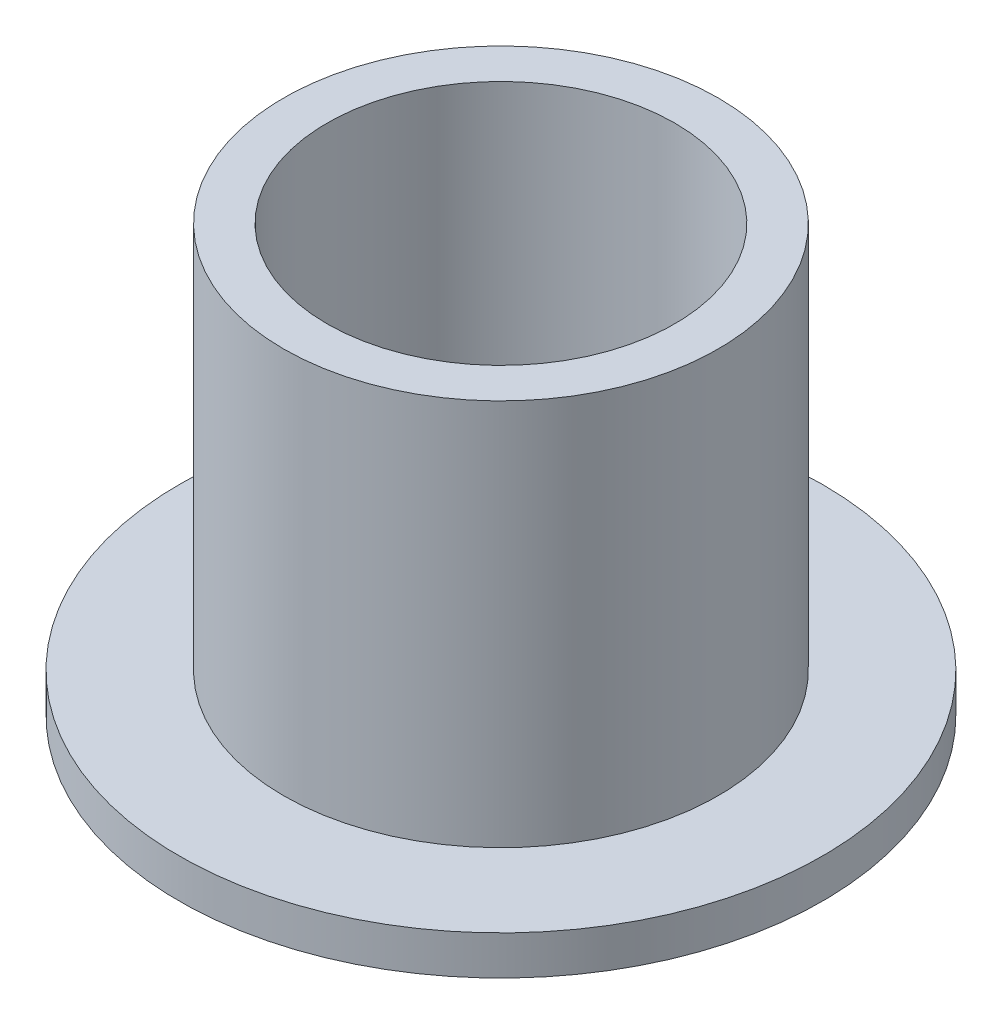
ISO-10303-21;
HEADER;
FILE_DESCRIPTION(('STEP AP214'),'2;1');
FILE_NAME('part.step','',(''),(''),'','','');
FILE_SCHEMA(('AUTOMOTIVE_DESIGN { 1 0 10303 214 1 1 1 1 }'));
ENDSEC;
DATA;
#1=APPLICATION_CONTEXT('core data for automotive mechanical design processes');
#2=APPLICATION_PROTOCOL_DEFINITION('international standard','automotive_design',2000,#1);
#3=PRODUCT_CONTEXT('',#1,'mechanical');
#4=PRODUCT('Part','Part','',(#3));
#5=PRODUCT_RELATED_PRODUCT_CATEGORY('part','',(#4));
#6=PRODUCT_DEFINITION_FORMATION('','',#4);
#7=PRODUCT_DEFINITION_CONTEXT('part definition',#1,'design');
#8=PRODUCT_DEFINITION('design','',#6,#7);
#9=PRODUCT_DEFINITION_SHAPE('','',#8);
#10=(LENGTH_UNIT() NAMED_UNIT(*) SI_UNIT(.MILLI.,.METRE.));
#11=(NAMED_UNIT(*) PLANE_ANGLE_UNIT() SI_UNIT($,.RADIAN.));
#12=(NAMED_UNIT(*) SI_UNIT($,.STERADIAN.) SOLID_ANGLE_UNIT());
#13=UNCERTAINTY_MEASURE_WITH_UNIT(LENGTH_MEASURE(1.E-05),#10,'distance_accuracy_value','');
#14=(GEOMETRIC_REPRESENTATION_CONTEXT(3) GLOBAL_UNCERTAINTY_ASSIGNED_CONTEXT((#13)) GLOBAL_UNIT_ASSIGNED_CONTEXT((#10,
#11,#12)) REPRESENTATION_CONTEXT('',''));
#15=CARTESIAN_POINT('',(0.,0.,0.));
#16=DIRECTION('',(0.,0.,1.));
#17=DIRECTION('',(1.,0.,0.));
#18=AXIS2_PLACEMENT_3D('',#15,#16,#17);
#19=CARTESIAN_POINT('',(0.,0.,0.));
#20=DIRECTION('',(0.,-1.,0.));
#21=DIRECTION('',(0.,0.,-1.));
#22=AXIS2_PLACEMENT_3D('',#19,#20,#21);
#23=CYLINDRICAL_SURFACE('',#22,4.);
#24=CARTESIAN_POINT('',(0.,9.8,0.));
#25=DIRECTION('',(0.,-1.,0.));
#26=DIRECTION('',(0.,0.,-1.));
#27=AXIS2_PLACEMENT_3D('',#24,#25,#26);
#28=CIRCLE('',#27,4.);
#29=CARTESIAN_POINT('',(0.,9.8,-4.));
#30=VERTEX_POINT('',#29);
#31=EDGE_CURVE('E57',#30,#30,#28,.T.);
#32=ORIENTED_EDGE('',*,*,#31,.F.);
#33=EDGE_LOOP('',(#32));
#34=FACE_BOUND('',#33,.T.);
#35=CARTESIAN_POINT('',(0.,0.,0.));
#36=DIRECTION('',(0.,-1.,0.));
#37=DIRECTION('',(0.,0.,-1.));
#38=AXIS2_PLACEMENT_3D('',#35,#36,#37);
#39=CIRCLE('',#38,4.);
#40=CARTESIAN_POINT('',(0.,0.,-4.));
#41=VERTEX_POINT('',#40);
#42=EDGE_CURVE('E10',#41,#41,#39,.T.);
#43=ORIENTED_EDGE('',*,*,#42,.T.);
#44=EDGE_LOOP('',(#43));
#45=FACE_BOUND('',#44,.T.);
#46=ADVANCED_FACE('F35',(#34,#45),#23,.F.);
#47=CARTESIAN_POINT('',(-4.,0.,0.));
#48=DIRECTION('',(0.,1.,0.));
#49=DIRECTION('',(0.,0.,1.));
#50=AXIS2_PLACEMENT_3D('',#47,#48,#49);
#51=PLANE('',#50);
#52=ORIENTED_EDGE('',*,*,#42,.F.);
#53=EDGE_LOOP('',(#52));
#54=FACE_BOUND('',#53,.T.);
#55=CARTESIAN_POINT('',(0.,0.,0.));
#56=DIRECTION('',(0.,-1.,0.));
#57=DIRECTION('',(0.,0.,-1.));
#58=AXIS2_PLACEMENT_3D('',#55,#56,#57);
#59=CIRCLE('',#58,7.4);
#60=CARTESIAN_POINT('',(0.,0.,-7.4));
#61=VERTEX_POINT('',#60);
#62=EDGE_CURVE('E41',#61,#61,#59,.T.);
#63=ORIENTED_EDGE('',*,*,#62,.T.);
#64=EDGE_LOOP('',(#63));
#65=FACE_BOUND('',#64,.T.);
#66=ADVANCED_FACE('F64',(#54,#65),#51,.F.);
#67=CARTESIAN_POINT('',(0.,0.,0.));
#68=DIRECTION('',(0.,-1.,0.));
#69=DIRECTION('',(0.,0.,-1.));
#70=AXIS2_PLACEMENT_3D('',#67,#68,#69);
#71=CYLINDRICAL_SURFACE('',#70,7.4);
#72=ORIENTED_EDGE('',*,*,#62,.F.);
#73=EDGE_LOOP('',(#72));
#74=FACE_BOUND('',#73,.T.);
#75=CARTESIAN_POINT('',(0.,0.9,0.));
#76=DIRECTION('',(0.,-1.,0.));
#77=DIRECTION('',(0.,0.,-1.));
#78=AXIS2_PLACEMENT_3D('',#75,#76,#77);
#79=CIRCLE('',#78,7.4);
#80=CARTESIAN_POINT('',(0.,0.9,-7.4));
#81=VERTEX_POINT('',#80);
#82=EDGE_CURVE('E45',#81,#81,#79,.T.);
#83=ORIENTED_EDGE('',*,*,#82,.T.);
#84=EDGE_LOOP('',(#83));
#85=FACE_BOUND('',#84,.T.);
#86=ADVANCED_FACE('F68',(#74,#85),#71,.T.);
#87=CARTESIAN_POINT('',(-7.4,0.899999999999999,0.));
#88=DIRECTION('',(0.,-1.,0.));
#89=DIRECTION('',(0.,0.,-1.));
#90=AXIS2_PLACEMENT_3D('',#87,#88,#89);
#91=PLANE('',#90);
#92=ORIENTED_EDGE('',*,*,#82,.F.);
#93=EDGE_LOOP('',(#92));
#94=FACE_BOUND('',#93,.T.);
#95=CARTESIAN_POINT('',(0.,0.899999999999999,0.));
#96=DIRECTION('',(0.,-1.,0.));
#97=DIRECTION('',(0.,0.,-1.));
#98=AXIS2_PLACEMENT_3D('',#95,#96,#97);
#99=CIRCLE('',#98,5.);
#100=CARTESIAN_POINT('',(0.,0.899999999999999,-5.));
#101=VERTEX_POINT('',#100);
#102=EDGE_CURVE('E49',#101,#101,#99,.T.);
#103=ORIENTED_EDGE('',*,*,#102,.T.);
#104=EDGE_LOOP('',(#103));
#105=FACE_BOUND('',#104,.T.);
#106=ADVANCED_FACE('F73',(#94,#105),#91,.F.);
#107=CARTESIAN_POINT('',(0.,0.,0.));
#108=DIRECTION('',(0.,-1.,0.));
#109=DIRECTION('',(0.,0.,-1.));
#110=AXIS2_PLACEMENT_3D('',#107,#108,#109);
#111=CYLINDRICAL_SURFACE('',#110,5.);
#112=ORIENTED_EDGE('',*,*,#102,.F.);
#113=EDGE_LOOP('',(#112));
#114=FACE_BOUND('',#113,.T.);
#115=CARTESIAN_POINT('',(0.,9.8,0.));
#116=DIRECTION('',(0.,-1.,0.));
#117=DIRECTION('',(0.,0.,-1.));
#118=AXIS2_PLACEMENT_3D('',#115,#116,#117);
#119=CIRCLE('',#118,5.);
#120=CARTESIAN_POINT('',(0.,9.8,-5.));
#121=VERTEX_POINT('',#120);
#122=EDGE_CURVE('E54',#121,#121,#119,.T.);
#123=ORIENTED_EDGE('',*,*,#122,.T.);
#124=EDGE_LOOP('',(#123));
#125=FACE_BOUND('',#124,.T.);
#126=ADVANCED_FACE('F79',(#114,#125),#111,.T.);
#127=CARTESIAN_POINT('',(-5.,9.8,0.));
#128=DIRECTION('',(0.,-1.,0.));
#129=DIRECTION('',(0.,0.,-1.));
#130=AXIS2_PLACEMENT_3D('',#127,#128,#129);
#131=PLANE('',#130);
#132=ORIENTED_EDGE('',*,*,#122,.F.);
#133=EDGE_LOOP('',(#132));
#134=FACE_BOUND('',#133,.T.);
#135=ORIENTED_EDGE('',*,*,#31,.T.);
#136=EDGE_LOOP('',(#135));
#137=FACE_BOUND('',#136,.T.);
#138=ADVANCED_FACE('F61',(#134,#137),#131,.F.);
#139=CLOSED_SHELL('',(#46,#66,#86,#106,#126,#138));
#140=MANIFOLD_SOLID_BREP('B2',#139);
#141=ADVANCED_BREP_SHAPE_REPRESENTATION('',(#18,#140),#14);
#142=SHAPE_DEFINITION_REPRESENTATION(#9,#141);
ENDSEC;
END-ISO-10303-21;
